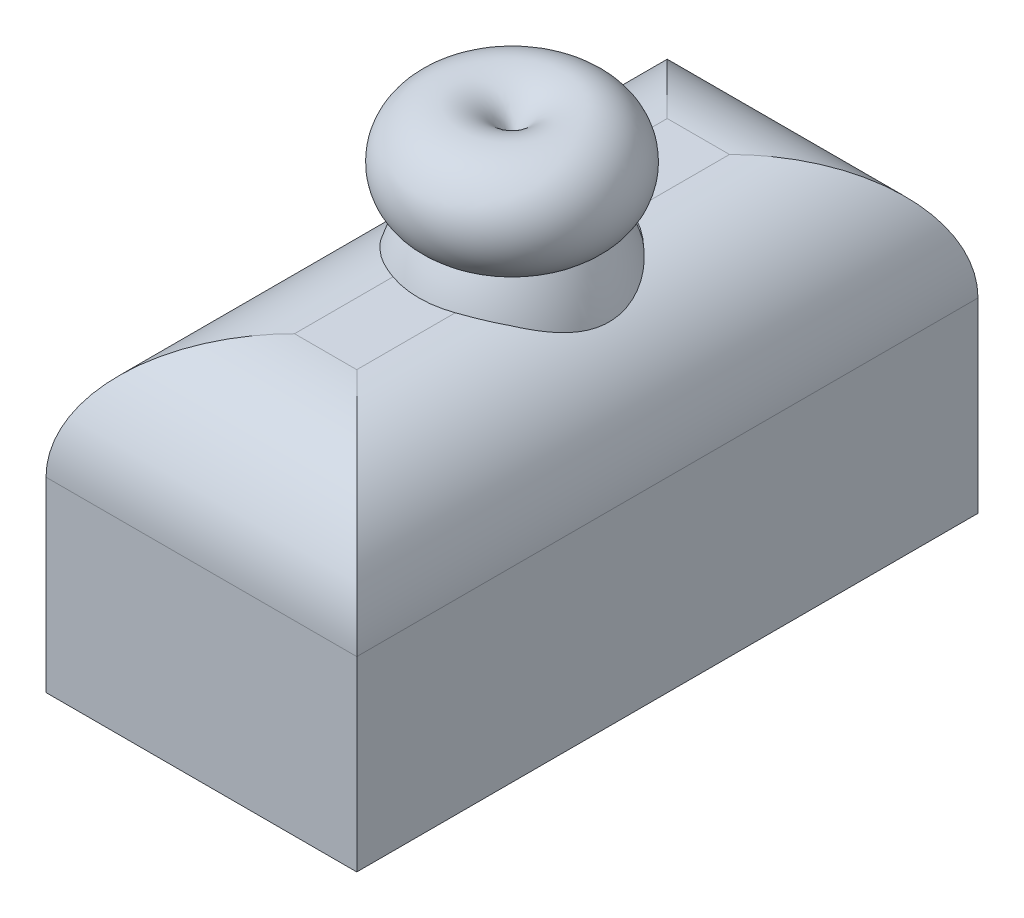
ISO-10303-21;
HEADER;
FILE_DESCRIPTION(('STEP AP214'),'2;1');
FILE_NAME('part.step','',(''),(''),'','','');
FILE_SCHEMA(('AUTOMOTIVE_DESIGN { 1 0 10303 214 1 1 1 1 }'));
ENDSEC;
DATA;
#1=APPLICATION_CONTEXT('core data for automotive mechanical design processes');
#2=APPLICATION_PROTOCOL_DEFINITION('international standard','automotive_design',2000,#1);
#3=PRODUCT_CONTEXT('',#1,'mechanical');
#4=PRODUCT('Part','Part','',(#3));
#5=PRODUCT_RELATED_PRODUCT_CATEGORY('part','',(#4));
#6=PRODUCT_DEFINITION_FORMATION('','',#4);
#7=PRODUCT_DEFINITION_CONTEXT('part definition',#1,'design');
#8=PRODUCT_DEFINITION('design','',#6,#7);
#9=PRODUCT_DEFINITION_SHAPE('','',#8);
#10=(LENGTH_UNIT() NAMED_UNIT(*) SI_UNIT(.MILLI.,.METRE.));
#11=(NAMED_UNIT(*) PLANE_ANGLE_UNIT() SI_UNIT($,.RADIAN.));
#12=(NAMED_UNIT(*) SI_UNIT($,.STERADIAN.) SOLID_ANGLE_UNIT());
#13=UNCERTAINTY_MEASURE_WITH_UNIT(LENGTH_MEASURE(1.E-05),#10,'distance_accuracy_value','');
#14=(GEOMETRIC_REPRESENTATION_CONTEXT(3) GLOBAL_UNCERTAINTY_ASSIGNED_CONTEXT((#13)) GLOBAL_UNIT_ASSIGNED_CONTEXT((#10,
#11,#12)) REPRESENTATION_CONTEXT('',''));
#15=CARTESIAN_POINT('',(0.,0.,0.));
#16=DIRECTION('',(0.,0.,1.));
#17=DIRECTION('',(1.,0.,0.));
#18=AXIS2_PLACEMENT_3D('',#15,#16,#17);
#19=CARTESIAN_POINT('',(0.,-2.49381121123041,0.));
#20=DIRECTION('',(0.,1.,0.));
#21=DIRECTION('',(0.,0.,1.));
#22=AXIS2_PLACEMENT_3D('',#19,#20,#21);
#23=CYLINDRICAL_SURFACE('',#22,7.5);
#24=CARTESIAN_POINT('',(0.,12.1351734631822,0.));
#25=DIRECTION('',(0.,-1.,0.));
#26=DIRECTION('',(0.,0.,-1.));
#27=AXIS2_PLACEMENT_3D('',#24,#25,#26);
#28=CIRCLE('',#27,7.5);
#29=CARTESIAN_POINT('',(-5.20482810144685,12.1351734631822,5.39997818832532));
#30=VERTEX_POINT('',#29);
#31=CARTESIAN_POINT('',(5.20482810146576,12.1351734631769,5.39997818830709));
#32=VERTEX_POINT('',#31);
#33=EDGE_CURVE('E71',#30,#32,#28,.F.);
#34=ORIENTED_EDGE('',*,*,#33,.F.);
#35=CARTESIAN_POINT('',(-2.50618878876959,12.5061887887696,-7.0688766968342));
#36=CARTESIAN_POINT('',(-2.69340977044015,12.5062237454459,-7.00254015515798));
#37=CARTESIAN_POINT('',(-2.87790268235287,12.5009328313389,-6.92872034036788));
#38=CARTESIAN_POINT('',(-3.23987864521699,12.480873455107,-6.7669998656051));
#39=CARTESIAN_POINT('',(-3.41736814991659,12.4661139457098,-6.6791125655434));
#40=CARTESIAN_POINT('',(-3.76307332725659,12.4284038409796,-6.49059741697196));
#41=CARTESIAN_POINT('',(-3.9313394292885,12.4055043071417,-6.39005145839393));
#42=CARTESIAN_POINT('',(-4.2587722476819,12.3528097130188,-6.17665338883722));
#43=CARTESIAN_POINT('',(-4.41793697922744,12.3230131557371,-6.06379860904877));
#44=CARTESIAN_POINT('',(-4.72572957551193,12.2580243568646,-5.82709548595134));
#45=CARTESIAN_POINT('',(-4.87439376132837,12.2228521957008,-5.70328874995074));
#46=CARTESIAN_POINT('',(-5.16121738056839,12.1484283611522,-5.44509718770811));
#47=CARTESIAN_POINT('',(-5.29937312828654,12.1091752677515,-5.31070868336882));
#48=CARTESIAN_POINT('',(-5.56482145277314,12.0279568919326,-5.03188655346383));
#49=CARTESIAN_POINT('',(-5.69209384199597,11.9859868126334,-4.88743512544396));
#50=CARTESIAN_POINT('',(-5.9350170170493,11.9008524424317,-4.58939414768688));
#51=CARTESIAN_POINT('',(-6.05066700347995,11.8576880696447,-4.43580397053299));
#52=CARTESIAN_POINT('',(-6.28032141325029,11.767536180448,-4.10510108605388));
#53=CARTESIAN_POINT('',(-6.39311981887519,11.7205761277863,-3.92714132295807));
#54=CARTESIAN_POINT('',(-6.60353711058572,11.6289572605701,-3.56197802867618));
#55=CARTESIAN_POINT('',(-6.70116110483616,11.5842976750085,-3.37477763624633));
#56=CARTESIAN_POINT('',(-6.88058381234446,11.4992155446822,-2.99202729298674));
#57=CARTESIAN_POINT('',(-6.96238456860547,11.4587924532355,-2.79647842404824));
#58=CARTESIAN_POINT('',(-7.10940519244128,11.3840941156787,-2.39820471754507));
#59=CARTESIAN_POINT('',(-7.17463377359388,11.3498156415589,-2.19548371520553));
#60=CARTESIAN_POINT('',(-7.28736346214718,11.2893792447785,-1.78580240473253));
#61=CARTESIAN_POINT('',(-7.33500625352014,11.2631567187532,-1.57889081025306));
#62=CARTESIAN_POINT('',(-7.4126700460801,11.2198808005729,-1.16082519011854));
#63=CARTESIAN_POINT('',(-7.44269136239829,11.2028272444463,-0.949671240400908));
#64=CARTESIAN_POINT('',(-7.4846256043876,11.178890473072,-0.525187469930888));
#65=CARTESIAN_POINT('',(-7.49655515509324,11.1719979207537,-0.311859828383151));
#66=CARTESIAN_POINT('',(-7.50215434981059,11.1687718118978,0.115103151541502));
#67=CARTESIAN_POINT('',(-7.49582593840192,11.172437130885,0.328738454728416));
#68=CARTESIAN_POINT('',(-7.4669665255379,11.1889823411266,0.727460579438291));
#69=CARTESIAN_POINT('',(-7.44657384899241,11.2006450970163,0.912758043279996));
#70=CARTESIAN_POINT('',(-7.39217194840578,11.2313331540822,1.28078319497562));
#71=CARTESIAN_POINT('',(-7.3581582140434,11.2503608939452,1.46351001084798));
#72=CARTESIAN_POINT('',(-7.27688715012526,11.2949646578533,1.82517470932253));
#73=CARTESIAN_POINT('',(-7.22962970451171,11.3205407392831,2.00411255870634));
#74=CARTESIAN_POINT('',(-7.12232446935367,11.3772067523263,2.35724175132309));
#75=CARTESIAN_POINT('',(-7.06227180688941,11.4082987838725,2.53143125761313));
#76=CARTESIAN_POINT('',(-6.85939015354275,11.5102494254812,3.05653698584554));
#77=CARTESIAN_POINT('',(-6.69642551427014,11.5882480840491,3.39849384004362));
#78=CARTESIAN_POINT('',(-6.32187654562294,11.7518454697152,4.05293634949572));
#79=CARTESIAN_POINT('',(-6.11024498315746,11.8374515302365,4.36539295535895));
#80=CARTESIAN_POINT('',(-5.74400968304658,11.9685506416059,4.82718085403022));
#81=CARTESIAN_POINT('',(-5.60459249704314,12.0153081887126,4.98839179402497));
#82=CARTESIAN_POINT('',(-5.31207950496375,12.105688055913,5.2987979299319));
#83=CARTESIAN_POINT('',(-5.1589885357147,12.1493114748666,5.44799733945301));
#84=CARTESIAN_POINT('',(-4.84011408105927,12.2314055642054,5.73314513498958));
#85=CARTESIAN_POINT('',(-4.67435277062716,12.2698849269837,5.8691157662672));
#86=CARTESIAN_POINT('',(-4.33092084826919,12.3398593407116,6.12692720772641));
#87=CARTESIAN_POINT('',(-4.15325504527622,12.3713571900218,6.24877366984268));
#88=CARTESIAN_POINT('',(-3.74121822112794,12.4323218569062,6.50583915485537));
#89=CARTESIAN_POINT('',(-3.50376716330218,12.4593166464027,6.63679753324442));
#90=CARTESIAN_POINT('',(-3.13712577369321,12.4870216579879,6.81373268452963));
#91=CARTESIAN_POINT('',(-3.01303479011425,12.4941261705124,6.86950796763159));
#92=CARTESIAN_POINT('',(-2.76179014158875,12.5037129740521,6.97431365113431));
#93=CARTESIAN_POINT('',(-2.63463495405911,12.5061929170932,7.02334061360286));
#94=CARTESIAN_POINT('',(-2.50618878876959,12.5061887887696,7.0688766968342));
#95=B_SPLINE_CURVE_WITH_KNOTS('',3,(#35,#36,#37,#38,#39,#40,#41,#42,#43,#44,#45,#46,#47,#48,#49,
#50,#51,#52,#53,#54,#55,#56,#57,#58,#59,#60,#61,#62,#63,#64,#65,#66,#67,#68,#69,#70,#71,#72,#73,
#74,#75,#76,#77,#78,#79,#80,#81,#82,#83,#84,#85,#86,#87,#88,#89,#90,#91,#92,#93,#94),
.UNSPECIFIED.,.F.,.F.,(4,2,2,2,2,2,2,2,2,2,2,2,2,2,2,2,2,2,2,2,2,2,2,2,2,2,2,2,2,4),(0.,
0.595544180371226,1.19052609124865,1.78183976226535,2.37328189828321,2.96256640693775,
3.55205665584143,4.14261764774881,4.73321923123909,5.38007651604577,6.02671557537111,
6.6732710886666,7.31948593902115,7.96037448680731,8.60125157300379,9.24153938153217,
9.8817589981858,10.441443019427,11.0013125214767,11.5611869299493,12.1212749428666,
13.2767108347857,14.4332728894483,15.0872069642749,15.7409106322473,16.3934953234751,
17.0458179679586,17.8610617762124,18.2695248960266,18.6781953432414),.UNSPECIFIED.);
#96=CARTESIAN_POINT('',(-2.50618878876959,12.5061887887696,7.0688766968342));
#97=VERTEX_POINT('',#96);
#98=EDGE_CURVE('E244',#30,#97,#95,.T.);
#99=ORIENTED_EDGE('',*,*,#98,.T.);
#100=CARTESIAN_POINT('',(0.,12.5061887887696,0.));
#101=DIRECTION('',(0.,1.,0.));
#102=DIRECTION('',(0.,0.,1.));
#103=AXIS2_PLACEMENT_3D('',#100,#101,#102);
#104=CIRCLE('',#103,7.5);
#105=CARTESIAN_POINT('',(2.50618878876959,12.5061887887696,7.0688766968342));
#106=VERTEX_POINT('',#105);
#107=EDGE_CURVE('E191',#97,#106,#104,.T.);
#108=ORIENTED_EDGE('',*,*,#107,.T.);
#109=CARTESIAN_POINT('',(2.50618878876959,12.5061887887696,7.0688766968342));
#110=CARTESIAN_POINT('',(2.69340977044015,12.5062237454459,7.00254015515798));
#111=CARTESIAN_POINT('',(2.87790268235287,12.5009328313389,6.92872034036788));
#112=CARTESIAN_POINT('',(3.23987864521699,12.480873455107,6.7669998656051));
#113=CARTESIAN_POINT('',(3.41736814991659,12.4661139457098,6.6791125655434));
#114=CARTESIAN_POINT('',(3.76307332725659,12.4284038409796,6.49059741697196));
#115=CARTESIAN_POINT('',(3.9313394292885,12.4055043071417,6.39005145839393));
#116=CARTESIAN_POINT('',(4.2587722476819,12.3528097130188,6.17665338883722));
#117=CARTESIAN_POINT('',(4.41793697922744,12.3230131557371,6.06379860904877));
#118=CARTESIAN_POINT('',(4.72572957551193,12.2580243568646,5.82709548595134));
#119=CARTESIAN_POINT('',(4.87439376132837,12.2228521957008,5.70328874995074));
#120=CARTESIAN_POINT('',(5.16121738056839,12.1484283611522,5.44509718770811));
#121=CARTESIAN_POINT('',(5.29937312828654,12.1091752677515,5.31070868336882));
#122=CARTESIAN_POINT('',(5.56482145277314,12.0279568919326,5.03188655346383));
#123=CARTESIAN_POINT('',(5.69209384199597,11.9859868126334,4.88743512544396));
#124=CARTESIAN_POINT('',(5.9350170170493,11.9008524424317,4.58939414768688));
#125=CARTESIAN_POINT('',(6.05066700347995,11.8576880696447,4.43580397053299));
#126=CARTESIAN_POINT('',(6.28032141325029,11.767536180448,4.10510108605388));
#127=CARTESIAN_POINT('',(6.39311981887519,11.7205761277863,3.92714132295807));
#128=CARTESIAN_POINT('',(6.60353711058572,11.6289572605701,3.56197802867618));
#129=CARTESIAN_POINT('',(6.70116110483616,11.5842976750085,3.37477763624633));
#130=CARTESIAN_POINT('',(6.88058381234446,11.4992155446822,2.99202729298674));
#131=CARTESIAN_POINT('',(6.96238456860547,11.4587924532355,2.79647842404824));
#132=CARTESIAN_POINT('',(7.10940519244128,11.3840941156787,2.39820471754507));
#133=CARTESIAN_POINT('',(7.17463377359388,11.3498156415589,2.19548371520553));
#134=CARTESIAN_POINT('',(7.28736346214718,11.2893792447785,1.78580240473253));
#135=CARTESIAN_POINT('',(7.33500625352014,11.2631567187532,1.57889081025306));
#136=CARTESIAN_POINT('',(7.4126700460801,11.2198808005729,1.16082519011854));
#137=CARTESIAN_POINT('',(7.44269136239829,11.2028272444463,0.949671240400908));
#138=CARTESIAN_POINT('',(7.4846256043876,11.178890473072,0.525187469930888));
#139=CARTESIAN_POINT('',(7.49655515509324,11.1719979207537,0.311859828383151));
#140=CARTESIAN_POINT('',(7.50215434981059,11.1687718118978,-0.115103151541502));
#141=CARTESIAN_POINT('',(7.49582593840192,11.172437130885,-0.328738454728416));
#142=CARTESIAN_POINT('',(7.4669665255379,11.1889823411266,-0.727460579438291));
#143=CARTESIAN_POINT('',(7.44657384899241,11.2006450970163,-0.912758043279996));
#144=CARTESIAN_POINT('',(7.39217194840578,11.2313331540822,-1.28078319497562));
#145=CARTESIAN_POINT('',(7.3581582140434,11.2503608939452,-1.46351001084798));
#146=CARTESIAN_POINT('',(7.27688715012526,11.2949646578533,-1.82517470932253));
#147=CARTESIAN_POINT('',(7.22962970451171,11.3205407392831,-2.00411255870634));
#148=CARTESIAN_POINT('',(7.12232446935367,11.3772067523263,-2.35724175132309));
#149=CARTESIAN_POINT('',(7.06227180688941,11.4082987838725,-2.53143125761313));
#150=CARTESIAN_POINT('',(6.85939015354275,11.5102494254812,-3.05653698584554));
#151=CARTESIAN_POINT('',(6.69642551427014,11.5882480840491,-3.39849384004362));
#152=CARTESIAN_POINT('',(6.32187654562294,11.7518454697152,-4.05293634949572));
#153=CARTESIAN_POINT('',(6.11024498315746,11.8374515302365,-4.36539295535895));
#154=CARTESIAN_POINT('',(5.74400968304658,11.9685506416059,-4.82718085403022));
#155=CARTESIAN_POINT('',(5.60459249704314,12.0153081887126,-4.98839179402497));
#156=CARTESIAN_POINT('',(5.31207950496375,12.105688055913,-5.2987979299319));
#157=CARTESIAN_POINT('',(5.1589885357147,12.1493114748666,-5.44799733945301));
#158=CARTESIAN_POINT('',(4.84011408105927,12.2314055642054,-5.73314513498958));
#159=CARTESIAN_POINT('',(4.67435277062716,12.2698849269837,-5.8691157662672));
#160=CARTESIAN_POINT('',(4.33092084826919,12.3398593407116,-6.12692720772641));
#161=CARTESIAN_POINT('',(4.15325504527622,12.3713571900218,-6.24877366984268));
#162=CARTESIAN_POINT('',(3.74121822112794,12.4323218569062,-6.50583915485537));
#163=CARTESIAN_POINT('',(3.50376716330218,12.4593166464027,-6.63679753324442));
#164=CARTESIAN_POINT('',(3.13712577369321,12.4870216579879,-6.81373268452963));
#165=CARTESIAN_POINT('',(3.01303479011425,12.4941261705124,-6.86950796763159));
#166=CARTESIAN_POINT('',(2.76179014158875,12.5037129740521,-6.97431365113431));
#167=CARTESIAN_POINT('',(2.63463495405911,12.5061929170932,-7.02334061360286));
#168=CARTESIAN_POINT('',(2.50618878876959,12.5061887887696,-7.0688766968342));
#169=B_SPLINE_CURVE_WITH_KNOTS('',3,(#109,#110,#111,#112,#113,#114,#115,#116,#117,#118,#119,
#120,#121,#122,#123,#124,#125,#126,#127,#128,#129,#130,#131,#132,#133,#134,#135,#136,#137,#138,
#139,#140,#141,#142,#143,#144,#145,#146,#147,#148,#149,#150,#151,#152,#153,#154,#155,#156,#157,
#158,#159,#160,#161,#162,#163,#164,#165,#166,#167,#168),.UNSPECIFIED.,.F.,.F.,(4,2,2,2,2,2,2,2,
2,2,2,2,2,2,2,2,2,2,2,2,2,2,2,2,2,2,2,2,2,4),(0.,0.595544180371226,1.19052609124865,
1.78183976226535,2.37328189828321,2.96256640693775,3.55205665584143,4.14261764774881,
4.73321923123909,5.38007651604577,6.02671557537111,6.6732710886666,7.31948593902115,
7.96037448680731,8.60125157300379,9.24153938153217,9.8817589981858,10.441443019427,
11.0013125214767,11.5611869299493,12.1212749428666,13.2767108347857,14.4332728894483,
15.0872069642749,15.7409106322473,16.3934953234751,17.0458179679586,17.8610617762124,
18.2695248960266,18.6781953432414),.UNSPECIFIED.);
#170=EDGE_CURVE('E254',#106,#32,#169,.T.);
#171=ORIENTED_EDGE('',*,*,#170,.T.);
#172=EDGE_LOOP('',(#34,#99,#108,#171));
#173=FACE_BOUND('',#172,.T.);
#174=ADVANCED_FACE('F46',(#173),#23,.F.);
#175=CARTESIAN_POINT('',(5.20482810144683,12.1351734631822,-5.39997818832533));
#176=VERTEX_POINT('',#175);
#177=CARTESIAN_POINT('',(-5.20482810144685,12.1351734631822,-5.39997818832532));
#178=VERTEX_POINT('',#177);
#179=EDGE_CURVE('E331',#176,#178,#28,.F.);
#180=ORIENTED_EDGE('',*,*,#179,.F.);
#181=CARTESIAN_POINT('',(2.50618878876959,12.5061887887696,-7.0688766968342));
#182=VERTEX_POINT('',#181);
#183=EDGE_CURVE('E253',#176,#182,#169,.T.);
#184=ORIENTED_EDGE('',*,*,#183,.T.);
#185=CARTESIAN_POINT('',(-2.50618878876959,12.5061887887696,-7.0688766968342));
#186=VERTEX_POINT('',#185);
#187=EDGE_CURVE('E183',#182,#186,#104,.T.);
#188=ORIENTED_EDGE('',*,*,#187,.T.);
#189=EDGE_CURVE('E245',#186,#178,#95,.T.);
#190=ORIENTED_EDGE('',*,*,#189,.T.);
#191=EDGE_LOOP('',(#180,#184,#188,#190));
#192=FACE_BOUND('',#191,.T.);
#193=ADVANCED_FACE('F153',(#192),#23,.F.);
#194=CARTESIAN_POINT('',(-2.50618878876959,2.50618878876959,-25.));
#195=DIRECTION('',(0.,0.,1.));
#196=DIRECTION('',(1.,0.,0.));
#197=AXIS2_PLACEMENT_3D('',#194,#195,#196);
#198=CYLINDRICAL_SURFACE('',#197,10.);
#199=ORIENTED_EDGE('',*,*,#98,.F.);
#200=CARTESIAN_POINT('',(-2.01154951487101,12.4939478962329,7.1028420672835));
#201=CARTESIAN_POINT('',(-2.12588778605893,12.4996125221451,7.06844719017373));
#202=CARTESIAN_POINT('',(-2.23965739498083,12.5032760388545,7.03190802348733));
#203=CARTESIAN_POINT('',(-2.46579100099275,12.5067462619613,6.95457376761191));
#204=CARTESIAN_POINT('',(-2.57815510661529,12.5065532680201,6.9137790093389));
#205=CARTESIAN_POINT('',(-2.91255348459404,12.5004122894505,6.78513254109694));
#206=CARTESIAN_POINT('',(-3.13210991134553,12.4889124109758,6.69095380629629));
#207=CARTESIAN_POINT('',(-3.5609800589438,12.4527202213984,6.48690475581925));
#208=CARTESIAN_POINT('',(-3.77034729573816,12.428107415369,6.37713189991084));
#209=CARTESIAN_POINT('',(-4.17845288840591,12.3675313261268,6.1420350478545));
#210=CARTESIAN_POINT('',(-4.37719076453414,12.3315675311037,6.01671035063651));
#211=CARTESIAN_POINT('',(-4.74052592373239,12.2549430693948,5.76620725083882));
#212=CARTESIAN_POINT('',(-4.90643907985061,12.2152774930887,5.64262384932768));
#213=CARTESIAN_POINT('',(-5.22760468015216,12.1301943923363,5.38414046863238));
#214=CARTESIAN_POINT('',(-5.38285832267582,12.0847775160881,5.24924176531272));
#215=CARTESIAN_POINT('',(-5.68208184078036,11.9897742880916,4.96822454582601));
#216=CARTESIAN_POINT('',(-5.82602906507636,11.9401799592285,4.8220846121861));
#217=CARTESIAN_POINT('',(-6.10140946158721,11.8387085372418,4.51916956883178));
#218=CARTESIAN_POINT('',(-6.23284171011754,11.7868312760359,4.36239367557624));
#219=CARTESIAN_POINT('',(-6.49200374210456,11.6786747580881,4.02593890377873));
#220=CARTESIAN_POINT('',(-6.61864494283115,11.6223677908392,3.84542742698264));
#221=CARTESIAN_POINT('',(-6.85510505601,11.5119626824046,3.47299513724082));
#222=CARTESIAN_POINT('',(-6.96492151990663,11.4578648635617,3.28107266924936));
#223=CARTESIAN_POINT('',(-7.16617647113433,11.3547637808388,2.88700983795068));
#224=CARTESIAN_POINT('',(-7.25765248015359,11.3057502166676,2.68489141723148));
#225=CARTESIAN_POINT('',(-7.42106628769428,11.2155350363994,2.27125449665591));
#226=CARTESIAN_POINT('',(-7.49301314939156,11.1743297992677,2.05974041039954));
#227=CARTESIAN_POINT('',(-7.59897369888572,11.1123602700623,1.68863400799527));
#228=CARTESIAN_POINT('',(-7.63797505584626,11.0890947359229,1.53086838919763));
#229=CARTESIAN_POINT('',(-7.70457071681657,11.0489251674647,1.21216321089908));
#230=CARTESIAN_POINT('',(-7.73216765478292,11.0320196643184,1.05122439328451));
#231=CARTESIAN_POINT('',(-7.77556314477732,11.0052679200486,0.727309532357694));
#232=CARTESIAN_POINT('',(-7.79137119976014,10.9954159933317,0.56433523782549));
#233=CARTESIAN_POINT('',(-7.81099165153451,10.9831695256644,0.237376618155901));
#234=CARTESIAN_POINT('',(-7.81480369604478,10.980775203718,0.0733922634982375));
#235=CARTESIAN_POINT('',(-7.81036943646184,10.983551244319,-0.254483928233386));
#236=CARTESIAN_POINT('',(-7.80211316568528,10.9887278593675,-0.418375576888141));
#237=CARTESIAN_POINT('',(-7.77365244400702,11.0064302116404,-0.744709323248074));
#238=CARTESIAN_POINT('',(-7.75344795315311,11.0189559734386,-0.907151416104412));
#239=CARTESIAN_POINT('',(-7.70136930743455,11.0508379812714,-1.22954416299676));
#240=CARTESIAN_POINT('',(-7.66948995155107,11.0701972714256,-1.38949367345554));
#241=CARTESIAN_POINT('',(-7.5944865720011,11.1149703837229,-1.70589557132559));
#242=CARTESIAN_POINT('',(-7.5513579887651,11.1403866605399,-1.86234651270461));
#243=CARTESIAN_POINT('',(-7.40496927698906,11.2248343830032,-2.32791287700418));
#244=CARTESIAN_POINT('',(-7.28515287150387,11.2917711774012,-2.63053209247262));
#245=CARTESIAN_POINT('',(-7.00613781662065,11.4378796490175,-3.21364678082167));
#246=CARTESIAN_POINT('',(-6.84692560443491,11.517055536256,-3.49413459057516));
#247=CARTESIAN_POINT('',(-6.56519888561536,11.646091173285,-3.92158779550757));
#248=CARTESIAN_POINT('',(-6.45403010653336,11.6948018258823,-4.07652769111009));
#249=CARTESIAN_POINT('',(-6.22004622472533,11.7918381784179,-4.37746687607375));
#250=CARTESIAN_POINT('',(-6.09723284307118,11.840163934103,-4.52346748142828));
#251=CARTESIAN_POINT('',(-5.84053924182246,11.9349136345991,-4.80640841169698));
#252=CARTESIAN_POINT('',(-5.70664477122654,11.9813350118626,-4.94333664854722));
#253=CARTESIAN_POINT('',(-5.42870395245725,12.0707175719422,-5.20759547572431));
#254=CARTESIAN_POINT('',(-5.28466056544039,12.1136797562745,-5.33492884329751));
#255=CARTESIAN_POINT('',(-4.96550355601402,12.2006689853122,-5.59753523965173));
#256=CARTESIAN_POINT('',(-4.78891656708886,12.2439436462158,-5.73127340751907));
#257=CARTESIAN_POINT('',(-4.42465147045568,12.3222059133307,-5.98526943470168));
#258=CARTESIAN_POINT('',(-4.2369772043834,12.3571963691402,-6.10553192185796));
#259=CARTESIAN_POINT('',(-3.85215644717036,12.4171034872569,-6.33193408279199));
#260=CARTESIAN_POINT('',(-3.65502536013254,12.4420359485923,-6.43809572871349));
#261=CARTESIAN_POINT('',(-3.25266364319811,12.4803339604188,-6.63596051540812));
#262=CARTESIAN_POINT('',(-3.04743807880127,12.4937066285727,-6.72767252470473));
#263=CARTESIAN_POINT('',(-2.70340518979173,12.5051653547458,-6.86680225191222));
#264=CARTESIAN_POINT('',(-2.56642971199304,12.5069588067124,-6.91850417705141));
#265=CARTESIAN_POINT('',(-2.29043288312226,12.5048141376169,-7.01548561170138));
#266=CARTESIAN_POINT('',(-2.15141386420017,12.5008821135832,-7.06077189686385));
#267=CARTESIAN_POINT('',(-2.01154951487101,12.4939478962329,-7.1028420672835));
#268=B_SPLINE_CURVE_WITH_KNOTS('',3,(#200,#201,#202,#203,#204,#205,#206,#207,#208,#209,#210,
#211,#212,#213,#214,#215,#216,#217,#218,#219,#220,#221,#222,#223,#224,#225,#226,#227,#228,#229,
#230,#231,#232,#233,#234,#235,#236,#237,#238,#239,#240,#241,#242,#243,#244,#245,#246,#247,#248,
#249,#250,#251,#252,#253,#254,#255,#256,#257,#258,#259,#260,#261,#262,#263,#264,#265,#266,#267),
.UNSPECIFIED.,.F.,.F.,(4,2,2,2,2,2,2,2,2,2,2,2,2,2,2,2,2,2,2,2,2,2,2,2,2,2,2,2,2,2,2,2,2,4),(0.,
0.358522391478262,0.717016924905078,1.43333145506333,2.14535151120916,2.85740367656902,
3.48870987130544,4.11994497812764,4.75241405069526,5.38492976736511,6.06678580326957,
6.74874097770805,7.42928641382103,8.10951547721116,8.60153224619742,9.09343531574184,
9.58494143500198,10.0764619879597,10.5683886952345,11.060317047413,11.5524648151593,
12.0448123724936,13.0377003815061,14.0309306886496,14.6208977784732,15.2107778067035,
15.8014286127091,16.3919077921202,17.0681880693477,17.74423538081,18.4192165877329,
19.0937818946756,19.532791105981,19.9713331605063),.UNSPECIFIED.);
#269=EDGE_CURVE('E333',#30,#178,#268,.T.);
#270=ORIENTED_EDGE('',*,*,#269,.T.);
#271=ORIENTED_EDGE('',*,*,#189,.F.);
#272=DIRECTION('',(0.,0.,1.));
#273=VECTOR('',#272,1.);
#274=CARTESIAN_POINT('',(-2.50618878876959,12.5061887887696,-25.));
#275=LINE('',#274,#273);
#276=CARTESIAN_POINT('',(-2.50618878876959,12.5061887887696,-15.));
#277=VERTEX_POINT('',#276);
#278=EDGE_CURVE('E235',#277,#186,#275,.T.);
#279=ORIENTED_EDGE('',*,*,#278,.F.);
#280=CARTESIAN_POINT('',(-2.50618878876959,2.50618878876959,-15.));
#281=DIRECTION('',(-0.707106781186547,0.,0.707106781186547));
#282=DIRECTION('',(0.707106781186547,0.,0.707106781186547));
#283=AXIS2_PLACEMENT_3D('',#280,#281,#282);
#284=ELLIPSE('',#283,14.1421356237309,10.);
#285=CARTESIAN_POINT('',(-12.5061887887696,2.50618878876958,-25.));
#286=VERTEX_POINT('',#285);
#287=EDGE_CURVE('E196',#286,#277,#284,.F.);
#288=ORIENTED_EDGE('',*,*,#287,.F.);
#289=DIRECTION('',(0.,0.,1.));
#290=VECTOR('',#289,1.);
#291=CARTESIAN_POINT('',(-12.5061887887696,2.50618878876959,-25.));
#292=LINE('',#291,#290);
#293=CARTESIAN_POINT('',(-12.5061887887696,2.50618878876958,25.));
#294=VERTEX_POINT('',#293);
#295=EDGE_CURVE('E302',#294,#286,#292,.F.);
#296=ORIENTED_EDGE('',*,*,#295,.F.);
#297=CARTESIAN_POINT('',(-2.50618878876959,2.50618878876959,15.));
#298=DIRECTION('',(-0.707106781186547,0.,-0.707106781186547));
#299=DIRECTION('',(-0.707106781186547,0.,0.707106781186547));
#300=AXIS2_PLACEMENT_3D('',#297,#298,#299);
#301=ELLIPSE('',#300,14.1421356237309,10.);
#302=CARTESIAN_POINT('',(-2.50618878876959,12.5061887887696,15.));
#303=VERTEX_POINT('',#302);
#304=EDGE_CURVE('E289',#303,#294,#301,.F.);
#305=ORIENTED_EDGE('',*,*,#304,.F.);
#306=DIRECTION('',(0.,0.,1.));
#307=VECTOR('',#306,1.);
#308=CARTESIAN_POINT('',(-2.50618878876959,12.5061887887696,-25.));
#309=LINE('',#308,#307);
#310=EDGE_CURVE('E228',#97,#303,#309,.T.);
#311=ORIENTED_EDGE('',*,*,#310,.F.);
#312=EDGE_LOOP('',(#199,#270,#271,#279,#288,#296,#305,#311));
#313=FACE_BOUND('',#312,.T.);
#314=ADVANCED_FACE('F48',(#313),#198,.T.);
#315=CARTESIAN_POINT('',(2.50618878876959,2.50618878876959,-25.));
#316=DIRECTION('',(0.,0.,-1.));
#317=DIRECTION('',(-1.,0.,0.));
#318=AXIS2_PLACEMENT_3D('',#315,#316,#317);
#319=CYLINDRICAL_SURFACE('',#318,10.);
#320=ORIENTED_EDGE('',*,*,#183,.F.);
#321=CARTESIAN_POINT('',(2.01154951487101,12.4939478962329,-7.1028420672835));
#322=CARTESIAN_POINT('',(2.12588778605893,12.4996125221451,-7.06844719017373));
#323=CARTESIAN_POINT('',(2.23965739498083,12.5032760388545,-7.03190802348733));
#324=CARTESIAN_POINT('',(2.46579100099275,12.5067462619613,-6.95457376761191));
#325=CARTESIAN_POINT('',(2.57815510661529,12.5065532680201,-6.9137790093389));
#326=CARTESIAN_POINT('',(2.91255348459404,12.5004122894505,-6.78513254109694));
#327=CARTESIAN_POINT('',(3.13210991134553,12.4889124109758,-6.69095380629629));
#328=CARTESIAN_POINT('',(3.5609800589438,12.4527202213984,-6.48690475581925));
#329=CARTESIAN_POINT('',(3.77034729573816,12.428107415369,-6.37713189991084));
#330=CARTESIAN_POINT('',(4.17845288840591,12.3675313261268,-6.1420350478545));
#331=CARTESIAN_POINT('',(4.37719076453414,12.3315675311037,-6.01671035063651));
#332=CARTESIAN_POINT('',(4.74052592373239,12.2549430693948,-5.76620725083882));
#333=CARTESIAN_POINT('',(4.90643907985061,12.2152774930887,-5.64262384932768));
#334=CARTESIAN_POINT('',(5.22760468015216,12.1301943923363,-5.38414046863238));
#335=CARTESIAN_POINT('',(5.38285832267582,12.0847775160881,-5.24924176531272));
#336=CARTESIAN_POINT('',(5.68208184078036,11.9897742880916,-4.96822454582601));
#337=CARTESIAN_POINT('',(5.82602906507636,11.9401799592285,-4.8220846121861));
#338=CARTESIAN_POINT('',(6.10140946158721,11.8387085372418,-4.51916956883178));
#339=CARTESIAN_POINT('',(6.23284171011754,11.7868312760359,-4.36239367557624));
#340=CARTESIAN_POINT('',(6.49200374210456,11.6786747580881,-4.02593890377873));
#341=CARTESIAN_POINT('',(6.61864494283115,11.6223677908392,-3.84542742698264));
#342=CARTESIAN_POINT('',(6.85510505601,11.5119626824046,-3.47299513724082));
#343=CARTESIAN_POINT('',(6.96492151990663,11.4578648635617,-3.28107266924936));
#344=CARTESIAN_POINT('',(7.16617647113433,11.3547637808388,-2.88700983795068));
#345=CARTESIAN_POINT('',(7.25765248015359,11.3057502166676,-2.68489141723148));
#346=CARTESIAN_POINT('',(7.42106628769428,11.2155350363994,-2.27125449665591));
#347=CARTESIAN_POINT('',(7.49301314939156,11.1743297992677,-2.05974041039954));
#348=CARTESIAN_POINT('',(7.59897369888572,11.1123602700623,-1.68863400799527));
#349=CARTESIAN_POINT('',(7.63797505584626,11.0890947359229,-1.53086838919763));
#350=CARTESIAN_POINT('',(7.70457071681657,11.0489251674647,-1.21216321089908));
#351=CARTESIAN_POINT('',(7.73216765478292,11.0320196643184,-1.05122439328451));
#352=CARTESIAN_POINT('',(7.77556314477732,11.0052679200486,-0.727309532357694));
#353=CARTESIAN_POINT('',(7.79137119976014,10.9954159933317,-0.56433523782549));
#354=CARTESIAN_POINT('',(7.81099165153451,10.9831695256644,-0.237376618155901));
#355=CARTESIAN_POINT('',(7.81480369604478,10.980775203718,-0.0733922634982375));
#356=CARTESIAN_POINT('',(7.81036943646184,10.983551244319,0.254483928233386));
#357=CARTESIAN_POINT('',(7.80211316568528,10.9887278593675,0.418375576888141));
#358=CARTESIAN_POINT('',(7.77365244400702,11.0064302116404,0.744709323248074));
#359=CARTESIAN_POINT('',(7.75344795315311,11.0189559734386,0.907151416104412));
#360=CARTESIAN_POINT('',(7.70136930743455,11.0508379812714,1.22954416299676));
#361=CARTESIAN_POINT('',(7.66948995155107,11.0701972714256,1.38949367345554));
#362=CARTESIAN_POINT('',(7.5944865720011,11.1149703837229,1.70589557132559));
#363=CARTESIAN_POINT('',(7.5513579887651,11.1403866605399,1.86234651270461));
#364=CARTESIAN_POINT('',(7.40496927698906,11.2248343830032,2.32791287700418));
#365=CARTESIAN_POINT('',(7.28515287150387,11.2917711774012,2.63053209247262));
#366=CARTESIAN_POINT('',(7.00613781662065,11.4378796490175,3.21364678082167));
#367=CARTESIAN_POINT('',(6.84692560443491,11.517055536256,3.49413459057516));
#368=CARTESIAN_POINT('',(6.56519888561536,11.646091173285,3.92158779550757));
#369=CARTESIAN_POINT('',(6.45403010653336,11.6948018258823,4.07652769111009));
#370=CARTESIAN_POINT('',(6.22004622472533,11.7918381784179,4.37746687607375));
#371=CARTESIAN_POINT('',(6.09723284307118,11.840163934103,4.52346748142828));
#372=CARTESIAN_POINT('',(5.84053924182246,11.9349136345991,4.80640841169698));
#373=CARTESIAN_POINT('',(5.70664477122654,11.9813350118626,4.94333664854722));
#374=CARTESIAN_POINT('',(5.42870395245725,12.0707175719422,5.20759547572431));
#375=CARTESIAN_POINT('',(5.28466056544039,12.1136797562745,5.33492884329751));
#376=CARTESIAN_POINT('',(4.96550355601402,12.2006689853122,5.59753523965173));
#377=CARTESIAN_POINT('',(4.78891656708886,12.2439436462158,5.73127340751907));
#378=CARTESIAN_POINT('',(4.42465147045568,12.3222059133307,5.98526943470168));
#379=CARTESIAN_POINT('',(4.2369772043834,12.3571963691402,6.10553192185796));
#380=CARTESIAN_POINT('',(3.85215644717036,12.4171034872569,6.33193408279199));
#381=CARTESIAN_POINT('',(3.65502536013254,12.4420359485923,6.43809572871349));
#382=CARTESIAN_POINT('',(3.25266364319811,12.4803339604188,6.63596051540812));
#383=CARTESIAN_POINT('',(3.04743807880127,12.4937066285727,6.72767252470473));
#384=CARTESIAN_POINT('',(2.70340518979173,12.5051653547458,6.86680225191222));
#385=CARTESIAN_POINT('',(2.56642971199304,12.5069588067124,6.91850417705141));
#386=CARTESIAN_POINT('',(2.29043288312226,12.5048141376169,7.01548561170138));
#387=CARTESIAN_POINT('',(2.15141386420017,12.5008821135832,7.06077189686385));
#388=CARTESIAN_POINT('',(2.01154951487101,12.4939478962329,7.1028420672835));
#389=B_SPLINE_CURVE_WITH_KNOTS('',3,(#321,#322,#323,#324,#325,#326,#327,#328,#329,#330,#331,
#332,#333,#334,#335,#336,#337,#338,#339,#340,#341,#342,#343,#344,#345,#346,#347,#348,#349,#350,
#351,#352,#353,#354,#355,#356,#357,#358,#359,#360,#361,#362,#363,#364,#365,#366,#367,#368,#369,
#370,#371,#372,#373,#374,#375,#376,#377,#378,#379,#380,#381,#382,#383,#384,#385,#386,#387,#388),
.UNSPECIFIED.,.F.,.F.,(4,2,2,2,2,2,2,2,2,2,2,2,2,2,2,2,2,2,2,2,2,2,2,2,2,2,2,2,2,2,2,2,2,4),(0.,
0.358522391478262,0.717016924905078,1.43333145506333,2.14535151120916,2.85740367656902,
3.48870987130544,4.11994497812764,4.75241405069526,5.38492976736511,6.06678580326957,
6.74874097770805,7.42928641382103,8.10951547721116,8.60153224619742,9.09343531574184,
9.58494143500198,10.0764619879597,10.5683886952345,11.060317047413,11.5524648151593,
12.0448123724936,13.0377003815061,14.0309306886496,14.6208977784732,15.2107778067035,
15.8014286127091,16.3919077921202,17.0681880693477,17.74423538081,18.4192165877329,
19.0937818946756,19.532791105981,19.9713331605063),.UNSPECIFIED.);
#390=EDGE_CURVE('E51',#176,#32,#389,.T.);
#391=ORIENTED_EDGE('',*,*,#390,.T.);
#392=ORIENTED_EDGE('',*,*,#170,.F.);
#393=DIRECTION('',(0.,0.,1.));
#394=VECTOR('',#393,1.);
#395=CARTESIAN_POINT('',(2.50618878876959,12.5061887887696,-25.));
#396=LINE('',#395,#394);
#397=CARTESIAN_POINT('',(2.50618878876959,12.5061887887696,15.));
#398=VERTEX_POINT('',#397);
#399=EDGE_CURVE('E231',#398,#106,#396,.F.);
#400=ORIENTED_EDGE('',*,*,#399,.F.);
#401=CARTESIAN_POINT('',(2.50618878876959,2.50618878876959,15.));
#402=DIRECTION('',(-0.707106781186547,0.,0.707106781186547));
#403=DIRECTION('',(-0.707106781186547,0.,-0.707106781186547));
#404=AXIS2_PLACEMENT_3D('',#401,#402,#403);
#405=ELLIPSE('',#404,14.1421356237309,10.);
#406=CARTESIAN_POINT('',(12.5061887887696,2.50618878876958,25.));
#407=VERTEX_POINT('',#406);
#408=EDGE_CURVE('E297',#398,#407,#405,.F.);
#409=ORIENTED_EDGE('',*,*,#408,.T.);
#410=DIRECTION('',(0.,0.,1.));
#411=VECTOR('',#410,1.);
#412=CARTESIAN_POINT('',(12.5061887887696,2.50618878876959,25.));
#413=LINE('',#412,#411);
#414=CARTESIAN_POINT('',(12.5061887887696,2.50618878876958,-25.));
#415=VERTEX_POINT('',#414);
#416=EDGE_CURVE('E219',#415,#407,#413,.T.);
#417=ORIENTED_EDGE('',*,*,#416,.F.);
#418=CARTESIAN_POINT('',(2.50618878876959,2.50618878876959,-15.));
#419=DIRECTION('',(0.707106781186547,0.,0.707106781186547));
#420=DIRECTION('',(0.707106781186547,0.,-0.707106781186547));
#421=AXIS2_PLACEMENT_3D('',#418,#419,#420);
#422=ELLIPSE('',#421,14.1421356237309,10.);
#423=CARTESIAN_POINT('',(2.50618878876959,12.5061887887696,-15.));
#424=VERTEX_POINT('',#423);
#425=EDGE_CURVE('E292',#415,#424,#422,.T.);
#426=ORIENTED_EDGE('',*,*,#425,.T.);
#427=DIRECTION('',(0.,0.,1.));
#428=VECTOR('',#427,1.);
#429=CARTESIAN_POINT('',(2.50618878876959,12.5061887887696,-25.));
#430=LINE('',#429,#428);
#431=EDGE_CURVE('E241',#182,#424,#430,.F.);
#432=ORIENTED_EDGE('',*,*,#431,.F.);
#433=EDGE_LOOP('',(#320,#391,#392,#400,#409,#417,#426,#432));
#434=FACE_BOUND('',#433,.T.);
#435=ADVANCED_FACE('F264',(#434),#319,.T.);
#436=CARTESIAN_POINT('',(-12.5061887887696,12.5061887887696,-25.));
#437=DIRECTION('',(0.,-1.,0.));
#438=DIRECTION('',(0.,0.,-1.));
#439=AXIS2_PLACEMENT_3D('',#436,#437,#438);
#440=PLANE('',#439);
#441=ORIENTED_EDGE('',*,*,#187,.F.);
#442=ORIENTED_EDGE('',*,*,#431,.T.);
#443=DIRECTION('',(1.,0.,0.));
#444=VECTOR('',#443,1.);
#445=CARTESIAN_POINT('',(-12.5061887887696,12.5061887887696,-15.));
#446=LINE('',#445,#444);
#447=EDGE_CURVE('E238',#424,#277,#446,.F.);
#448=ORIENTED_EDGE('',*,*,#447,.T.);
#449=ORIENTED_EDGE('',*,*,#278,.T.);
#450=EDGE_LOOP('',(#441,#442,#448,#449));
#451=FACE_BOUND('',#450,.T.);
#452=ADVANCED_FACE('F267',(#451),#440,.F.);
#453=CARTESIAN_POINT('',(-12.5061887887696,-12.5061887887696,-25.));
#454=DIRECTION('',(0.,-1.,0.));
#455=DIRECTION('',(0.,0.,-1.));
#456=AXIS2_PLACEMENT_3D('',#453,#454,#455);
#457=PLANE('',#456);
#458=DIRECTION('',(0.,0.,1.));
#459=VECTOR('',#458,1.);
#460=CARTESIAN_POINT('',(12.5061887887696,-12.5061887887696,-25.));
#461=LINE('',#460,#459);
#462=CARTESIAN_POINT('',(12.5061887887696,-12.5061887887696,-25.));
#463=VERTEX_POINT('',#462);
#464=CARTESIAN_POINT('',(12.5061887887696,-12.5061887887696,25.));
#465=VERTEX_POINT('',#464);
#466=EDGE_CURVE('E215',#463,#465,#461,.T.);
#467=ORIENTED_EDGE('',*,*,#466,.T.);
#468=DIRECTION('',(1.,0.,0.));
#469=VECTOR('',#468,1.);
#470=CARTESIAN_POINT('',(-12.5061887887696,-12.5061887887696,25.));
#471=LINE('',#470,#469);
#472=CARTESIAN_POINT('',(-12.5061887887696,-12.5061887887696,25.));
#473=VERTEX_POINT('',#472);
#474=EDGE_CURVE('E182',#473,#465,#471,.T.);
#475=ORIENTED_EDGE('',*,*,#474,.F.);
#476=DIRECTION('',(0.,0.,1.));
#477=VECTOR('',#476,1.);
#478=CARTESIAN_POINT('',(-12.5061887887696,-12.5061887887696,-25.));
#479=LINE('',#478,#477);
#480=CARTESIAN_POINT('',(-12.5061887887696,-12.5061887887696,-25.));
#481=VERTEX_POINT('',#480);
#482=EDGE_CURVE('E216',#481,#473,#479,.T.);
#483=ORIENTED_EDGE('',*,*,#482,.F.);
#484=DIRECTION('',(1.,0.,0.));
#485=VECTOR('',#484,1.);
#486=CARTESIAN_POINT('',(-12.5061887887696,-12.5061887887696,-25.));
#487=LINE('',#486,#485);
#488=EDGE_CURVE('E203',#481,#463,#487,.T.);
#489=ORIENTED_EDGE('',*,*,#488,.T.);
#490=EDGE_LOOP('',(#467,#475,#483,#489));
#491=FACE_BOUND('',#490,.T.);
#492=ADVANCED_FACE('F269',(#491),#457,.T.);
#493=CARTESIAN_POINT('',(-12.5061887887696,-12.5061887887696,-25.));
#494=DIRECTION('',(1.,0.,0.));
#495=DIRECTION('',(0.,0.,-1.));
#496=AXIS2_PLACEMENT_3D('',#493,#494,#495);
#497=PLANE('',#496);
#498=DIRECTION('',(0.,1.,0.));
#499=VECTOR('',#498,1.);
#500=CARTESIAN_POINT('',(-12.5061887887696,-12.5061887887696,25.));
#501=LINE('',#500,#499);
#502=EDGE_CURVE('E200',#473,#294,#501,.T.);
#503=ORIENTED_EDGE('',*,*,#502,.T.);
#504=ORIENTED_EDGE('',*,*,#295,.T.);
#505=DIRECTION('',(0.,1.,0.));
#506=VECTOR('',#505,1.);
#507=CARTESIAN_POINT('',(-12.5061887887696,-12.5061887887696,-25.));
#508=LINE('',#507,#506);
#509=EDGE_CURVE('E211',#481,#286,#508,.T.);
#510=ORIENTED_EDGE('',*,*,#509,.F.);
#511=ORIENTED_EDGE('',*,*,#482,.T.);
#512=EDGE_LOOP('',(#503,#504,#510,#511));
#513=FACE_BOUND('',#512,.T.);
#514=ADVANCED_FACE('F360',(#513),#497,.F.);
#515=DIRECTION('',(1.,0.,0.));
#516=VECTOR('',#515,1.);
#517=CARTESIAN_POINT('',(12.5061887887696,12.5061887887696,15.));
#518=LINE('',#517,#516);
#519=EDGE_CURVE('E225',#303,#398,#518,.T.);
#520=ORIENTED_EDGE('',*,*,#519,.T.);
#521=ORIENTED_EDGE('',*,*,#399,.T.);
#522=ORIENTED_EDGE('',*,*,#107,.F.);
#523=ORIENTED_EDGE('',*,*,#310,.T.);
#524=EDGE_LOOP('',(#520,#521,#522,#523));
#525=FACE_BOUND('',#524,.T.);
#526=ADVANCED_FACE('F325',(#525),#440,.F.);
#527=CARTESIAN_POINT('',(12.5061887887696,-12.5061887887696,-25.));
#528=DIRECTION('',(1.,0.,0.));
#529=DIRECTION('',(0.,0.,-1.));
#530=AXIS2_PLACEMENT_3D('',#527,#528,#529);
#531=PLANE('',#530);
#532=DIRECTION('',(0.,1.,0.));
#533=VECTOR('',#532,1.);
#534=CARTESIAN_POINT('',(12.5061887887696,-12.5061887887696,-25.));
#535=LINE('',#534,#533);
#536=EDGE_CURVE('E207',#463,#415,#535,.T.);
#537=ORIENTED_EDGE('',*,*,#536,.T.);
#538=ORIENTED_EDGE('',*,*,#416,.T.);
#539=DIRECTION('',(0.,1.,0.));
#540=VECTOR('',#539,1.);
#541=CARTESIAN_POINT('',(12.5061887887696,-12.5061887887696,25.));
#542=LINE('',#541,#540);
#543=EDGE_CURVE('E188',#465,#407,#542,.T.);
#544=ORIENTED_EDGE('',*,*,#543,.F.);
#545=ORIENTED_EDGE('',*,*,#466,.F.);
#546=EDGE_LOOP('',(#537,#538,#544,#545));
#547=FACE_BOUND('',#546,.T.);
#548=ADVANCED_FACE('F311',(#547),#531,.T.);
#549=CARTESIAN_POINT('',(0.,0.,-25.));
#550=DIRECTION('',(0.,0.,1.));
#551=DIRECTION('',(1.,0.,0.));
#552=AXIS2_PLACEMENT_3D('',#549,#550,#551);
#553=PLANE('',#552);
#554=ORIENTED_EDGE('',*,*,#509,.T.);
#555=DIRECTION('',(1.,0.,0.));
#556=VECTOR('',#555,1.);
#557=CARTESIAN_POINT('',(0.,2.50618878876959,-25.));
#558=LINE('',#557,#556);
#559=EDGE_CURVE('E262',#286,#415,#558,.T.);
#560=ORIENTED_EDGE('',*,*,#559,.T.);
#561=ORIENTED_EDGE('',*,*,#536,.F.);
#562=ORIENTED_EDGE('',*,*,#488,.F.);
#563=EDGE_LOOP('',(#554,#560,#561,#562));
#564=FACE_BOUND('',#563,.T.);
#565=ADVANCED_FACE('F278',(#564),#553,.F.);
#566=CARTESIAN_POINT('',(0.,0.,25.));
#567=DIRECTION('',(0.,0.,1.));
#568=DIRECTION('',(1.,0.,0.));
#569=AXIS2_PLACEMENT_3D('',#566,#567,#568);
#570=PLANE('',#569);
#571=ORIENTED_EDGE('',*,*,#543,.T.);
#572=DIRECTION('',(1.,0.,0.));
#573=VECTOR('',#572,1.);
#574=CARTESIAN_POINT('',(-12.5061887887696,2.50618878876959,25.));
#575=LINE('',#574,#573);
#576=EDGE_CURVE('E79',#407,#294,#575,.F.);
#577=ORIENTED_EDGE('',*,*,#576,.T.);
#578=ORIENTED_EDGE('',*,*,#502,.F.);
#579=ORIENTED_EDGE('',*,*,#474,.T.);
#580=EDGE_LOOP('',(#571,#577,#578,#579));
#581=FACE_BOUND('',#580,.T.);
#582=ADVANCED_FACE('F273',(#581),#570,.T.);
#583=CARTESIAN_POINT('',(0.,2.50618878876959,-15.));
#584=DIRECTION('',(1.,0.,0.));
#585=DIRECTION('',(0.,0.,-1.));
#586=AXIS2_PLACEMENT_3D('',#583,#584,#585);
#587=CYLINDRICAL_SURFACE('',#586,10.);
#588=ORIENTED_EDGE('',*,*,#287,.T.);
#589=ORIENTED_EDGE('',*,*,#447,.F.);
#590=ORIENTED_EDGE('',*,*,#425,.F.);
#591=ORIENTED_EDGE('',*,*,#559,.F.);
#592=EDGE_LOOP('',(#588,#589,#590,#591));
#593=FACE_BOUND('',#592,.T.);
#594=ADVANCED_FACE('F148',(#593),#587,.T.);
#595=CARTESIAN_POINT('',(-12.5061887887696,2.50618878876959,15.));
#596=DIRECTION('',(-1.,0.,0.));
#597=DIRECTION('',(0.,0.,1.));
#598=AXIS2_PLACEMENT_3D('',#595,#596,#597);
#599=CYLINDRICAL_SURFACE('',#598,10.);
#600=ORIENTED_EDGE('',*,*,#304,.T.);
#601=ORIENTED_EDGE('',*,*,#576,.F.);
#602=ORIENTED_EDGE('',*,*,#408,.F.);
#603=ORIENTED_EDGE('',*,*,#519,.F.);
#604=EDGE_LOOP('',(#600,#601,#602,#603));
#605=FACE_BOUND('',#604,.T.);
#606=ADVANCED_FACE('F139',(#605),#599,.T.);
#607=CARTESIAN_POINT('',(0.,18.2613148695158,-4.16523458856192));
#608=DIRECTION('',(-1.,0.,0.));
#609=DIRECTION('',(0.,0.,-1.));
#610=AXIS2_PLACEMENT_3D('',#607,#608,#609);
#611=CIRCLE('',#610,4.17028297276039);
#612=TRIMMED_CURVE('',#611,(PARAMETER_VALUE(-3.09238277923402)),
(PARAMETER_VALUE(3.09238277923402)),.T.,.PARAMETER.);
#613=CARTESIAN_POINT('',(0.,18.2613148695158,0.));
#614=DIRECTION('',(0.,-1.,0.));
#615=AXIS1_PLACEMENT('',#613,#614);
#616=SURFACE_OF_REVOLUTION('',#612,#615);
#617=CARTESIAN_POINT('',(0.,14.7417457662842,0.));
#618=DIRECTION('',(0.,-1.,0.));
#619=DIRECTION('',(0.,0.,-1.));
#620=AXIS2_PLACEMENT_3D('',#617,#618,#619);
#621=CIRCLE('',#620,6.40217298746171);
#622=CARTESIAN_POINT('',(0.,14.7417457662842,-6.40217298746171));
#623=VERTEX_POINT('',#622);
#624=EDGE_CURVE('E348',#623,#623,#621,.T.);
#625=ORIENTED_EDGE('',*,*,#624,.F.);
#626=EDGE_LOOP('',(#625));
#627=FACE_BOUND('',#626,.T.);
#628=CARTESIAN_POINT('',(0.,18.4664511538309,0.));
#629=VERTEX_POINT('',#628);
#630=VERTEX_LOOP('',#629);
#631=FACE_BOUND('',#630,.T.);
#632=ADVANCED_FACE('F136',(#627,#631),#616,.T.);
#633=CARTESIAN_POINT('',(0.,7.60748120067545,0.));
#634=DIRECTION('',(0.,-1.,0.));
#635=DIRECTION('',(0.,0.,-1.));
#636=AXIS2_PLACEMENT_3D('',#633,#634,#635);
#637=DEGENERATE_TOROIDAL_SURFACE('',#636,6.89341419761837,15.0887497655759,.F.);
#638=ORIENTED_EDGE('',*,*,#269,.F.);
#639=ORIENTED_EDGE('',*,*,#33,.T.);
#640=ORIENTED_EDGE('',*,*,#390,.F.);
#641=ORIENTED_EDGE('',*,*,#179,.T.);
#642=EDGE_LOOP('',(#638,#639,#640,#641));
#643=FACE_BOUND('',#642,.T.);
#644=ORIENTED_EDGE('',*,*,#624,.T.);
#645=EDGE_LOOP('',(#644));
#646=FACE_BOUND('',#645,.T.);
#647=ADVANCED_FACE('F138',(#643,#646),#637,.F.);
#648=CLOSED_SHELL('',(#174,#193,#314,#435,#452,#492,#514,#526,#548,#565,#582,#594,#606,#632,#647));
#649=CARTESIAN_POINT('',(0.,-2.49381121123041,0.));
#650=DIRECTION('',(0.,1.,0.));
#651=DIRECTION('',(0.,0.,1.));
#652=AXIS2_PLACEMENT_3D('',#649,#650,#651);
#653=PLANE('',#652);
#654=CARTESIAN_POINT('',(0.,-2.49381121123041,0.));
#655=DIRECTION('',(0.,1.,0.));
#656=DIRECTION('',(0.,0.,1.));
#657=AXIS2_PLACEMENT_3D('',#654,#655,#656);
#658=CIRCLE('',#657,4.31525481780618);
#659=CARTESIAN_POINT('',(0.,-2.49381121123041,4.31525481780618));
#660=VERTEX_POINT('',#659);
#661=EDGE_CURVE('E300',#660,#660,#658,.F.);
#662=ORIENTED_EDGE('',*,*,#661,.T.);
#663=EDGE_LOOP('',(#662));
#664=FACE_BOUND('',#663,.T.);
#665=CARTESIAN_POINT('',(0.,-2.49381121123041,0.));
#666=DIRECTION('',(0.,1.,0.));
#667=DIRECTION('',(0.,0.,1.));
#668=AXIS2_PLACEMENT_3D('',#665,#666,#667);
#669=CIRCLE('',#668,7.5);
#670=CARTESIAN_POINT('',(0.,-2.49381121123041,7.5));
#671=VERTEX_POINT('',#670);
#672=EDGE_CURVE('E177',#671,#671,#669,.T.);
#673=ORIENTED_EDGE('',*,*,#672,.T.);
#674=EDGE_LOOP('',(#673));
#675=FACE_BOUND('',#674,.T.);
#676=ADVANCED_FACE('F165',(#664,#675),#653,.T.);
#677=ORIENTED_EDGE('',*,*,#672,.F.);
#678=EDGE_LOOP('',(#677));
#679=FACE_BOUND('',#678,.T.);
#680=CARTESIAN_POINT('',(0.,3.07978893816872,0.));
#681=DIRECTION('',(0.,1.,0.));
#682=DIRECTION('',(0.,0.,1.));
#683=AXIS2_PLACEMENT_3D('',#680,#681,#682);
#684=CIRCLE('',#683,7.5);
#685=CARTESIAN_POINT('',(0.,3.07978893816872,7.5));
#686=VERTEX_POINT('',#685);
#687=EDGE_CURVE('E11',#686,#686,#684,.F.);
#688=ORIENTED_EDGE('',*,*,#687,.F.);
#689=EDGE_LOOP('',(#688));
#690=FACE_BOUND('',#689,.T.);
#691=ADVANCED_FACE('F156',(#679,#690),#23,.F.);
#692=ORIENTED_EDGE('',*,*,#661,.F.);
#693=EDGE_LOOP('',(#692));
#694=FACE_BOUND('',#693,.T.);
#695=ORIENTED_EDGE('',*,*,#687,.T.);
#696=EDGE_LOOP('',(#695));
#697=FACE_BOUND('',#696,.T.);
#698=ADVANCED_FACE('F146',(#694,#697),#637,.F.);
#699=CLOSED_SHELL('',(#676,#691,#698));
#700=ORIENTED_CLOSED_SHELL('',*,#699,.T.);
#701=BREP_WITH_VOIDS('B2',#648,(#700));
#702=ADVANCED_BREP_SHAPE_REPRESENTATION('',(#18,#701),#14);
#703=SHAPE_DEFINITION_REPRESENTATION(#9,#702);
ENDSEC;
END-ISO-10303-21;
